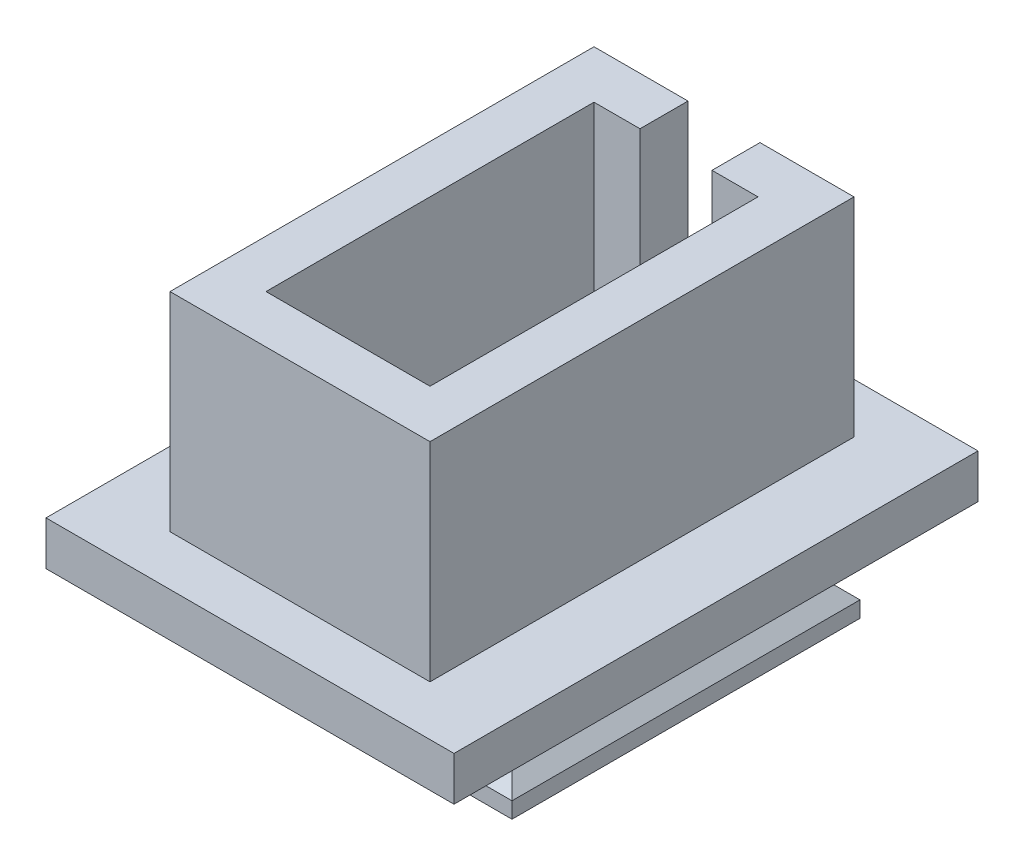
ISO-10303-21;
HEADER;
FILE_DESCRIPTION(('STEP AP214'),'2;1');
FILE_NAME('part.step','',(''),(''),'','','');
FILE_SCHEMA(('AUTOMOTIVE_DESIGN { 1 0 10303 214 1 1 1 1 }'));
ENDSEC;
DATA;
#1=APPLICATION_CONTEXT('core data for automotive mechanical design processes');
#2=APPLICATION_PROTOCOL_DEFINITION('international standard','automotive_design',2000,#1);
#3=PRODUCT_CONTEXT('',#1,'mechanical');
#4=PRODUCT('Part','Part','',(#3));
#5=PRODUCT_RELATED_PRODUCT_CATEGORY('part','',(#4));
#6=PRODUCT_DEFINITION_FORMATION('','',#4);
#7=PRODUCT_DEFINITION_CONTEXT('part definition',#1,'design');
#8=PRODUCT_DEFINITION('design','',#6,#7);
#9=PRODUCT_DEFINITION_SHAPE('','',#8);
#10=(LENGTH_UNIT() NAMED_UNIT(*) SI_UNIT(.MILLI.,.METRE.));
#11=(NAMED_UNIT(*) PLANE_ANGLE_UNIT() SI_UNIT($,.RADIAN.));
#12=(NAMED_UNIT(*) SI_UNIT($,.STERADIAN.) SOLID_ANGLE_UNIT());
#13=UNCERTAINTY_MEASURE_WITH_UNIT(LENGTH_MEASURE(1.E-05),#10,'distance_accuracy_value','');
#14=(GEOMETRIC_REPRESENTATION_CONTEXT(3) GLOBAL_UNCERTAINTY_ASSIGNED_CONTEXT((#13)) GLOBAL_UNIT_ASSIGNED_CONTEXT((#10,
#11,#12)) REPRESENTATION_CONTEXT('',''));
#15=CARTESIAN_POINT('',(0.,0.,0.));
#16=DIRECTION('',(0.,0.,1.));
#17=DIRECTION('',(1.,0.,0.));
#18=AXIS2_PLACEMENT_3D('',#15,#16,#17);
#19=CARTESIAN_POINT('',(0.,2.,0.));
#20=DIRECTION('',(0.,1.,0.));
#21=DIRECTION('',(0.,0.,1.));
#22=AXIS2_PLACEMENT_3D('',#19,#20,#21);
#23=PLANE('',#22);
#24=DIRECTION('',(0.,0.,1.));
#25=VECTOR('',#24,1.);
#26=CARTESIAN_POINT('',(-27.7004716981132,2.,-18.3643867924528));
#27=LINE('',#26,#25);
#28=CARTESIAN_POINT('',(-27.7004716981132,2.,-18.3643867924528));
#29=VERTEX_POINT('',#28);
#30=CARTESIAN_POINT('',(-27.7004716981132,2.,25.1356132075472));
#31=VERTEX_POINT('',#30);
#32=EDGE_CURVE('E322',#29,#31,#27,.T.);
#33=ORIENTED_EDGE('',*,*,#32,.F.);
#34=DIRECTION('',(-1.,0.,0.));
#35=VECTOR('',#34,1.);
#36=CARTESIAN_POINT('',(-27.7004716981132,2.,-18.3643867924528));
#37=LINE('',#36,#35);
#38=CARTESIAN_POINT('',(15.7995283018868,2.,-18.3643867924528));
#39=VERTEX_POINT('',#38);
#40=EDGE_CURVE('E330',#39,#29,#37,.T.);
#41=ORIENTED_EDGE('',*,*,#40,.F.);
#42=DIRECTION('',(0.,0.,-1.));
#43=VECTOR('',#42,1.);
#44=CARTESIAN_POINT('',(15.7995283018868,2.,-18.3643867924528));
#45=LINE('',#44,#43);
#46=CARTESIAN_POINT('',(15.7995283018868,2.,25.1356132075472));
#47=VERTEX_POINT('',#46);
#48=EDGE_CURVE('E327',#47,#39,#45,.T.);
#49=ORIENTED_EDGE('',*,*,#48,.F.);
#50=DIRECTION('',(1.,0.,0.));
#51=VECTOR('',#50,1.);
#52=CARTESIAN_POINT('',(-27.7004716981132,2.,25.1356132075472));
#53=LINE('',#52,#51);
#54=EDGE_CURVE('E325',#31,#47,#53,.T.);
#55=ORIENTED_EDGE('',*,*,#54,.F.);
#56=EDGE_LOOP('',(#33,#41,#49,#55));
#57=FACE_BOUND('',#56,.T.);
#58=ADVANCED_FACE('F46',(#57),#23,.F.);
#59=CARTESIAN_POINT('',(8.89976415094341,8.89976415094341,-18.3643867924528));
#60=DIRECTION('',(0.707106781186548,0.707106781186547,0.));
#61=DIRECTION('',(-0.707106781186547,0.707106781186548,0.));
#62=AXIS2_PLACEMENT_3D('',#59,#60,#61);
#63=PLANE('',#62);
#64=DIRECTION('',(0.577350269189626,-0.577350269189626,-0.577350269189626));
#65=VECTOR('',#64,1.);
#66=CARTESIAN_POINT('',(11.1996855345912,6.59984276729561,-13.7645440251572));
#67=LINE('',#66,#65);
#68=CARTESIAN_POINT('',(8.79952830188681,9.,-11.3643867924528));
#69=VERTEX_POINT('',#68);
#70=EDGE_CURVE('E310',#69,#39,#67,.T.);
#71=ORIENTED_EDGE('',*,*,#70,.F.);
#72=DIRECTION('',(0.,0.,1.));
#73=VECTOR('',#72,1.);
#74=CARTESIAN_POINT('',(8.79952830188681,9.,-18.3643867924528));
#75=LINE('',#74,#73);
#76=CARTESIAN_POINT('',(8.79952830188681,9.,18.1356132075472));
#77=VERTEX_POINT('',#76);
#78=EDGE_CURVE('E319',#69,#77,#75,.T.);
#79=ORIENTED_EDGE('',*,*,#78,.T.);
#80=DIRECTION('',(-0.577350269189626,0.577350269189626,-0.577350269189626));
#81=VECTOR('',#80,1.);
#82=CARTESIAN_POINT('',(-3.30031446540879,21.0998427672956,6.03577044025157));
#83=LINE('',#82,#81);
#84=EDGE_CURVE('E314',#47,#77,#83,.T.);
#85=ORIENTED_EDGE('',*,*,#84,.F.);
#86=ORIENTED_EDGE('',*,*,#48,.T.);
#87=EDGE_LOOP('',(#71,#79,#85,#86));
#88=FACE_BOUND('',#87,.T.);
#89=ADVANCED_FACE('F345',(#88),#63,.T.);
#90=CARTESIAN_POINT('',(-14.8502358490566,14.8502358490566,-18.3643867924528));
#91=DIRECTION('',(0.707106781186548,-0.707106781186547,0.));
#92=DIRECTION('',(0.707106781186547,0.707106781186548,0.));
#93=AXIS2_PLACEMENT_3D('',#90,#91,#92);
#94=PLANE('',#93);
#95=DIRECTION('',(0.,0.,1.));
#96=VECTOR('',#95,1.);
#97=CARTESIAN_POINT('',(-20.7004716981132,9.,-18.3643867924528));
#98=LINE('',#97,#96);
#99=CARTESIAN_POINT('',(-20.7004716981132,9.,-11.3643867924528));
#100=VERTEX_POINT('',#99);
#101=CARTESIAN_POINT('',(-20.7004716981132,9.,18.1356132075472));
#102=VERTEX_POINT('',#101);
#103=EDGE_CURVE('E317',#100,#102,#98,.T.);
#104=ORIENTED_EDGE('',*,*,#103,.F.);
#105=DIRECTION('',(-0.577350269189626,-0.577350269189626,-0.577350269189626));
#106=VECTOR('',#105,1.);
#107=CARTESIAN_POINT('',(-19.1336477987421,10.5668238993711,-9.79756289308177));
#108=LINE('',#107,#106);
#109=EDGE_CURVE('E12',#100,#29,#108,.T.);
#110=ORIENTED_EDGE('',*,*,#109,.T.);
#111=ORIENTED_EDGE('',*,*,#32,.T.);
#112=DIRECTION('',(0.577350269189626,0.577350269189626,-0.577350269189626));
#113=VECTOR('',#112,1.);
#114=CARTESIAN_POINT('',(-4.63364779874212,25.0668238993711,2.06878930817611));
#115=LINE('',#114,#113);
#116=EDGE_CURVE('E53',#31,#102,#115,.T.);
#117=ORIENTED_EDGE('',*,*,#116,.T.);
#118=EDGE_LOOP('',(#104,#110,#111,#117));
#119=FACE_BOUND('',#118,.T.);
#120=ADVANCED_FACE('F334',(#119),#94,.F.);
#121=CARTESIAN_POINT('',(-27.7004716981132,9.,18.1356132075472));
#122=DIRECTION('',(0.,-0.707106781186547,-0.707106781186547));
#123=DIRECTION('',(0.,0.707106781186548,-0.707106781186548));
#124=AXIS2_PLACEMENT_3D('',#121,#122,#123);
#125=PLANE('',#124);
#126=ORIENTED_EDGE('',*,*,#84,.T.);
#127=DIRECTION('',(1.,0.,0.));
#128=VECTOR('',#127,1.);
#129=CARTESIAN_POINT('',(-27.7004716981132,9.,18.1356132075472));
#130=LINE('',#129,#128);
#131=EDGE_CURVE('E312',#102,#77,#130,.T.);
#132=ORIENTED_EDGE('',*,*,#131,.F.);
#133=ORIENTED_EDGE('',*,*,#116,.F.);
#134=ORIENTED_EDGE('',*,*,#54,.T.);
#135=EDGE_LOOP('',(#126,#132,#133,#134));
#136=FACE_BOUND('',#135,.T.);
#137=ADVANCED_FACE('F339',(#136),#125,.F.);
#138=CARTESIAN_POINT('',(-27.7004716981132,9.,-11.3643867924528));
#139=DIRECTION('',(0.,-0.707106781186547,0.707106781186548));
#140=DIRECTION('',(0.,-0.707106781186548,-0.707106781186547));
#141=AXIS2_PLACEMENT_3D('',#138,#139,#140);
#142=PLANE('',#141);
#143=ORIENTED_EDGE('',*,*,#70,.T.);
#144=ORIENTED_EDGE('',*,*,#40,.T.);
#145=ORIENTED_EDGE('',*,*,#109,.F.);
#146=DIRECTION('',(1.,0.,0.));
#147=VECTOR('',#146,1.);
#148=CARTESIAN_POINT('',(-27.7004716981132,9.,-11.3643867924528));
#149=LINE('',#148,#147);
#150=EDGE_CURVE('E307',#100,#69,#149,.T.);
#151=ORIENTED_EDGE('',*,*,#150,.T.);
#152=EDGE_LOOP('',(#143,#144,#145,#151));
#153=FACE_BOUND('',#152,.T.);
#154=ADVANCED_FACE('F349',(#153),#142,.F.);
#155=CARTESIAN_POINT('',(0.,9.,0.));
#156=DIRECTION('',(0.,1.,0.));
#157=DIRECTION('',(0.,0.,1.));
#158=AXIS2_PLACEMENT_3D('',#155,#156,#157);
#159=PLANE('',#158);
#160=DIRECTION('',(0.,0.,1.));
#161=VECTOR('',#160,1.);
#162=CARTESIAN_POINT('',(-31.4504716981132,9.,36.1356132075472));
#163=LINE('',#162,#161);
#164=CARTESIAN_POINT('',(-31.4504716981132,9.,-29.3643867924528));
#165=VERTEX_POINT('',#164);
#166=CARTESIAN_POINT('',(-31.4504716981132,9.,36.1356132075472));
#167=VERTEX_POINT('',#166);
#168=EDGE_CURVE('E190',#165,#167,#163,.T.);
#169=ORIENTED_EDGE('',*,*,#168,.F.);
#170=DIRECTION('',(-1.,0.,0.));
#171=VECTOR('',#170,1.);
#172=CARTESIAN_POINT('',(19.5495283018868,9.,-29.3643867924528));
#173=LINE('',#172,#171);
#174=CARTESIAN_POINT('',(19.5495283018868,9.,-29.3643867924528));
#175=VERTEX_POINT('',#174);
#176=EDGE_CURVE('E282',#175,#165,#173,.T.);
#177=ORIENTED_EDGE('',*,*,#176,.F.);
#178=DIRECTION('',(0.,0.,-1.));
#179=VECTOR('',#178,1.);
#180=CARTESIAN_POINT('',(19.5495283018868,9.,36.1356132075472));
#181=LINE('',#180,#179);
#182=CARTESIAN_POINT('',(19.5495283018868,9.,36.1356132075472));
#183=VERTEX_POINT('',#182);
#184=EDGE_CURVE('E293',#183,#175,#181,.T.);
#185=ORIENTED_EDGE('',*,*,#184,.F.);
#186=DIRECTION('',(1.,0.,0.));
#187=VECTOR('',#186,1.);
#188=CARTESIAN_POINT('',(19.5495283018868,9.,36.1356132075472));
#189=LINE('',#188,#187);
#190=EDGE_CURVE('E291',#167,#183,#189,.T.);
#191=ORIENTED_EDGE('',*,*,#190,.F.);
#192=EDGE_LOOP('',(#169,#177,#185,#191));
#193=FACE_BOUND('',#192,.T.);
#194=ORIENTED_EDGE('',*,*,#103,.T.);
#195=ORIENTED_EDGE('',*,*,#131,.T.);
#196=ORIENTED_EDGE('',*,*,#78,.F.);
#197=ORIENTED_EDGE('',*,*,#150,.F.);
#198=EDGE_LOOP('',(#194,#195,#196,#197));
#199=FACE_BOUND('',#198,.T.);
#200=ADVANCED_FACE('F342',(#193,#199),#159,.F.);
#201=CARTESIAN_POINT('',(-31.4504716981132,14.5,36.1356132075472));
#202=DIRECTION('',(1.,0.,0.));
#203=DIRECTION('',(0.,0.,-1.));
#204=AXIS2_PLACEMENT_3D('',#201,#202,#203);
#205=PLANE('',#204);
#206=ORIENTED_EDGE('',*,*,#168,.T.);
#207=DIRECTION('',(0.,-1.,0.));
#208=VECTOR('',#207,1.);
#209=CARTESIAN_POINT('',(-31.4504716981132,14.5,36.1356132075472));
#210=LINE('',#209,#208);
#211=CARTESIAN_POINT('',(-31.4504716981132,14.5,36.1356132075472));
#212=VERTEX_POINT('',#211);
#213=EDGE_CURVE('E304',#212,#167,#210,.T.);
#214=ORIENTED_EDGE('',*,*,#213,.F.);
#215=DIRECTION('',(0.,0.,1.));
#216=VECTOR('',#215,1.);
#217=CARTESIAN_POINT('',(-31.4504716981132,14.5,36.1356132075472));
#218=LINE('',#217,#216);
#219=CARTESIAN_POINT('',(-31.4504716981132,14.5,-29.3643867924528));
#220=VERTEX_POINT('',#219);
#221=EDGE_CURVE('E278',#220,#212,#218,.T.);
#222=ORIENTED_EDGE('',*,*,#221,.F.);
#223=DIRECTION('',(0.,-1.,0.));
#224=VECTOR('',#223,1.);
#225=CARTESIAN_POINT('',(-31.4504716981132,14.5,-29.3643867924528));
#226=LINE('',#225,#224);
#227=EDGE_CURVE('E288',#220,#165,#226,.T.);
#228=ORIENTED_EDGE('',*,*,#227,.T.);
#229=EDGE_LOOP('',(#206,#214,#222,#228));
#230=FACE_BOUND('',#229,.T.);
#231=ADVANCED_FACE('F365',(#230),#205,.F.);
#232=CARTESIAN_POINT('',(19.5495283018868,14.5,36.1356132075472));
#233=DIRECTION('',(0.,0.,-1.));
#234=DIRECTION('',(-1.,0.,0.));
#235=AXIS2_PLACEMENT_3D('',#232,#233,#234);
#236=PLANE('',#235);
#237=ORIENTED_EDGE('',*,*,#190,.T.);
#238=DIRECTION('',(0.,-1.,0.));
#239=VECTOR('',#238,1.);
#240=CARTESIAN_POINT('',(19.5495283018868,14.5,36.1356132075472));
#241=LINE('',#240,#239);
#242=CARTESIAN_POINT('',(19.5495283018868,14.5,36.1356132075472));
#243=VERTEX_POINT('',#242);
#244=EDGE_CURVE('E301',#243,#183,#241,.T.);
#245=ORIENTED_EDGE('',*,*,#244,.F.);
#246=DIRECTION('',(1.,0.,0.));
#247=VECTOR('',#246,1.);
#248=CARTESIAN_POINT('',(19.5495283018868,14.5,36.1356132075472));
#249=LINE('',#248,#247);
#250=EDGE_CURVE('E281',#212,#243,#249,.T.);
#251=ORIENTED_EDGE('',*,*,#250,.F.);
#252=ORIENTED_EDGE('',*,*,#213,.T.);
#253=EDGE_LOOP('',(#237,#245,#251,#252));
#254=FACE_BOUND('',#253,.T.);
#255=ADVANCED_FACE('F368',(#254),#236,.F.);
#256=CARTESIAN_POINT('',(19.5495283018868,14.5,36.1356132075472));
#257=DIRECTION('',(-1.,0.,0.));
#258=DIRECTION('',(0.,0.,1.));
#259=AXIS2_PLACEMENT_3D('',#256,#257,#258);
#260=PLANE('',#259);
#261=ORIENTED_EDGE('',*,*,#184,.T.);
#262=DIRECTION('',(0.,-1.,0.));
#263=VECTOR('',#262,1.);
#264=CARTESIAN_POINT('',(19.5495283018868,14.5,-29.3643867924528));
#265=LINE('',#264,#263);
#266=CARTESIAN_POINT('',(19.5495283018868,14.5,-29.3643867924528));
#267=VERTEX_POINT('',#266);
#268=EDGE_CURVE('E298',#267,#175,#265,.T.);
#269=ORIENTED_EDGE('',*,*,#268,.F.);
#270=DIRECTION('',(0.,0.,-1.));
#271=VECTOR('',#270,1.);
#272=CARTESIAN_POINT('',(19.5495283018868,14.5,36.1356132075472));
#273=LINE('',#272,#271);
#274=EDGE_CURVE('E284',#243,#267,#273,.T.);
#275=ORIENTED_EDGE('',*,*,#274,.F.);
#276=ORIENTED_EDGE('',*,*,#244,.T.);
#277=EDGE_LOOP('',(#261,#269,#275,#276));
#278=FACE_BOUND('',#277,.T.);
#279=ADVANCED_FACE('F372',(#278),#260,.F.);
#280=CARTESIAN_POINT('',(19.5495283018868,14.5,-29.3643867924528));
#281=DIRECTION('',(0.,0.,1.));
#282=DIRECTION('',(1.,0.,0.));
#283=AXIS2_PLACEMENT_3D('',#280,#281,#282);
#284=PLANE('',#283);
#285=ORIENTED_EDGE('',*,*,#176,.T.);
#286=ORIENTED_EDGE('',*,*,#227,.F.);
#287=DIRECTION('',(-1.,0.,0.));
#288=VECTOR('',#287,1.);
#289=CARTESIAN_POINT('',(19.5495283018868,14.5,-29.3643867924528));
#290=LINE('',#289,#288);
#291=EDGE_CURVE('E286',#267,#220,#290,.T.);
#292=ORIENTED_EDGE('',*,*,#291,.F.);
#293=ORIENTED_EDGE('',*,*,#268,.T.);
#294=EDGE_LOOP('',(#285,#286,#292,#293));
#295=FACE_BOUND('',#294,.T.);
#296=ADVANCED_FACE('F376',(#295),#284,.F.);
#297=CARTESIAN_POINT('',(0.,14.5,0.));
#298=DIRECTION('',(0.,1.,0.));
#299=DIRECTION('',(0.,0.,1.));
#300=AXIS2_PLACEMENT_3D('',#297,#298,#299);
#301=PLANE('',#300);
#302=DIRECTION('',(0.,0.,-1.));
#303=VECTOR('',#302,1.);
#304=CARTESIAN_POINT('',(-1.45047169811266,14.5,0.));
#305=LINE('',#304,#303);
#306=CARTESIAN_POINT('',(-1.45047169811266,14.5,-17.1143867924528));
#307=VERTEX_POINT('',#306);
#308=CARTESIAN_POINT('',(-1.45047169811266,14.5,-23.1143867924528));
#309=VERTEX_POINT('',#308);
#310=EDGE_CURVE('E188',#307,#309,#305,.T.);
#311=ORIENTED_EDGE('',*,*,#310,.T.);
#312=DIRECTION('',(1.,0.,0.));
#313=VECTOR('',#312,1.);
#314=CARTESIAN_POINT('',(0.,14.5,-23.1143867924528));
#315=LINE('',#314,#313);
#316=CARTESIAN_POINT('',(10.2995283018873,14.5,-23.1143867924528));
#317=VERTEX_POINT('',#316);
#318=EDGE_CURVE('E205',#309,#317,#315,.T.);
#319=ORIENTED_EDGE('',*,*,#318,.T.);
#320=DIRECTION('',(0.,0.,-1.));
#321=VECTOR('',#320,1.);
#322=CARTESIAN_POINT('',(10.2995283018873,14.5,0.));
#323=LINE('',#322,#321);
#324=CARTESIAN_POINT('',(10.2995283018873,14.5,29.8856132075472));
#325=VERTEX_POINT('',#324);
#326=EDGE_CURVE('E207',#325,#317,#323,.T.);
#327=ORIENTED_EDGE('',*,*,#326,.F.);
#328=DIRECTION('',(1.,0.,0.));
#329=VECTOR('',#328,1.);
#330=CARTESIAN_POINT('',(0.,14.5,29.8856132075472));
#331=LINE('',#330,#329);
#332=CARTESIAN_POINT('',(-22.2004716981127,14.5,29.8856132075472));
#333=VERTEX_POINT('',#332);
#334=EDGE_CURVE('E243',#333,#325,#331,.T.);
#335=ORIENTED_EDGE('',*,*,#334,.F.);
#336=DIRECTION('',(0.,0.,-1.));
#337=VECTOR('',#336,1.);
#338=CARTESIAN_POINT('',(-22.2004716981127,14.5,0.));
#339=LINE('',#338,#337);
#340=CARTESIAN_POINT('',(-22.2004716981127,14.5,-23.1143867924528));
#341=VERTEX_POINT('',#340);
#342=EDGE_CURVE('E241',#333,#341,#339,.T.);
#343=ORIENTED_EDGE('',*,*,#342,.T.);
#344=CARTESIAN_POINT('',(-10.4504716981127,14.5,-23.1143867924528));
#345=VERTEX_POINT('',#344);
#346=EDGE_CURVE('E209',#341,#345,#315,.T.);
#347=ORIENTED_EDGE('',*,*,#346,.T.);
#348=DIRECTION('',(0.,0.,-1.));
#349=VECTOR('',#348,1.);
#350=CARTESIAN_POINT('',(-10.4504716981127,14.5,0.));
#351=LINE('',#350,#349);
#352=CARTESIAN_POINT('',(-10.4504716981127,14.5,-17.1143867924528));
#353=VERTEX_POINT('',#352);
#354=EDGE_CURVE('E238',#353,#345,#351,.T.);
#355=ORIENTED_EDGE('',*,*,#354,.F.);
#356=DIRECTION('',(1.,0.,0.));
#357=VECTOR('',#356,1.);
#358=CARTESIAN_POINT('',(0.,14.5,-17.1143867924528));
#359=LINE('',#358,#357);
#360=CARTESIAN_POINT('',(-16.2004716981127,14.5,-17.1143867924528));
#361=VERTEX_POINT('',#360);
#362=EDGE_CURVE('E231',#361,#353,#359,.T.);
#363=ORIENTED_EDGE('',*,*,#362,.F.);
#364=DIRECTION('',(0.,0.,-1.));
#365=VECTOR('',#364,1.);
#366=CARTESIAN_POINT('',(-16.2004716981127,14.5,0.));
#367=LINE('',#366,#365);
#368=CARTESIAN_POINT('',(-16.2004716981127,14.5,23.8856132075472));
#369=VERTEX_POINT('',#368);
#370=EDGE_CURVE('E235',#369,#361,#367,.T.);
#371=ORIENTED_EDGE('',*,*,#370,.F.);
#372=DIRECTION('',(1.,0.,0.));
#373=VECTOR('',#372,1.);
#374=CARTESIAN_POINT('',(0.,14.5,23.8856132075472));
#375=LINE('',#374,#373);
#376=CARTESIAN_POINT('',(4.29952830188734,14.5,23.8856132075472));
#377=VERTEX_POINT('',#376);
#378=EDGE_CURVE('E233',#369,#377,#375,.T.);
#379=ORIENTED_EDGE('',*,*,#378,.T.);
#380=DIRECTION('',(0.,0.,-1.));
#381=VECTOR('',#380,1.);
#382=CARTESIAN_POINT('',(4.29952830188734,14.5,0.));
#383=LINE('',#382,#381);
#384=CARTESIAN_POINT('',(4.29952830188734,14.5,-17.1143867924528));
#385=VERTEX_POINT('',#384);
#386=EDGE_CURVE('E65',#377,#385,#383,.T.);
#387=ORIENTED_EDGE('',*,*,#386,.T.);
#388=EDGE_CURVE('E60',#307,#385,#359,.T.);
#389=ORIENTED_EDGE('',*,*,#388,.F.);
#390=EDGE_LOOP('',(#311,#319,#327,#335,#343,#347,#355,#363,#371,#379,#387,#389));
#391=FACE_BOUND('',#390,.T.);
#392=ORIENTED_EDGE('',*,*,#221,.T.);
#393=ORIENTED_EDGE('',*,*,#250,.T.);
#394=ORIENTED_EDGE('',*,*,#274,.T.);
#395=ORIENTED_EDGE('',*,*,#291,.T.);
#396=EDGE_LOOP('',(#392,#393,#394,#395));
#397=FACE_BOUND('',#396,.T.);
#398=ADVANCED_FACE('F380',(#391,#397),#301,.T.);
#399=CARTESIAN_POINT('',(-1.45047169811266,40.5,0.));
#400=DIRECTION('',(-1.,0.,0.));
#401=DIRECTION('',(0.,0.,1.));
#402=AXIS2_PLACEMENT_3D('',#399,#400,#401);
#403=PLANE('',#402);
#404=ORIENTED_EDGE('',*,*,#310,.F.);
#405=DIRECTION('',(0.,-1.,0.));
#406=VECTOR('',#405,1.);
#407=CARTESIAN_POINT('',(-1.45047169811266,40.5,-17.1143867924528));
#408=LINE('',#407,#406);
#409=CARTESIAN_POINT('',(-1.45047169811266,40.5,-17.1143867924528));
#410=VERTEX_POINT('',#409);
#411=EDGE_CURVE('E181',#410,#307,#408,.T.);
#412=ORIENTED_EDGE('',*,*,#411,.F.);
#413=DIRECTION('',(0.,0.,-1.));
#414=VECTOR('',#413,1.);
#415=CARTESIAN_POINT('',(-1.45047169811266,40.5,0.));
#416=LINE('',#415,#414);
#417=CARTESIAN_POINT('',(-1.45047169811266,40.5,-23.1143867924528));
#418=VERTEX_POINT('',#417);
#419=EDGE_CURVE('E186',#410,#418,#416,.T.);
#420=ORIENTED_EDGE('',*,*,#419,.T.);
#421=DIRECTION('',(0.,-1.,0.));
#422=VECTOR('',#421,1.);
#423=CARTESIAN_POINT('',(-1.45047169811266,40.5,-23.1143867924528));
#424=LINE('',#423,#422);
#425=EDGE_CURVE('E248',#418,#309,#424,.T.);
#426=ORIENTED_EDGE('',*,*,#425,.T.);
#427=EDGE_LOOP('',(#404,#412,#420,#426));
#428=FACE_BOUND('',#427,.T.);
#429=ADVANCED_FACE('F183',(#428),#403,.T.);
#430=CARTESIAN_POINT('',(0.,40.5,-17.1143867924528));
#431=DIRECTION('',(0.,0.,-1.));
#432=DIRECTION('',(-1.,0.,0.));
#433=AXIS2_PLACEMENT_3D('',#430,#431,#432);
#434=PLANE('',#433);
#435=ORIENTED_EDGE('',*,*,#388,.T.);
#436=DIRECTION('',(0.,-1.,0.));
#437=VECTOR('',#436,1.);
#438=CARTESIAN_POINT('',(4.29952830188734,40.5,-17.1143867924528));
#439=LINE('',#438,#437);
#440=CARTESIAN_POINT('',(4.29952830188734,40.5,-17.1143867924528));
#441=VERTEX_POINT('',#440);
#442=EDGE_CURVE('E191',#441,#385,#439,.T.);
#443=ORIENTED_EDGE('',*,*,#442,.F.);
#444=DIRECTION('',(1.,0.,0.));
#445=VECTOR('',#444,1.);
#446=CARTESIAN_POINT('',(0.,40.5,-17.1143867924528));
#447=LINE('',#446,#445);
#448=EDGE_CURVE('E194',#410,#441,#447,.T.);
#449=ORIENTED_EDGE('',*,*,#448,.F.);
#450=ORIENTED_EDGE('',*,*,#411,.T.);
#451=EDGE_LOOP('',(#435,#443,#449,#450));
#452=FACE_BOUND('',#451,.T.);
#453=ADVANCED_FACE('F195',(#452),#434,.F.);
#454=CARTESIAN_POINT('',(4.29952830188734,40.5,0.));
#455=DIRECTION('',(-1.,0.,0.));
#456=DIRECTION('',(0.,0.,1.));
#457=AXIS2_PLACEMENT_3D('',#454,#455,#456);
#458=PLANE('',#457);
#459=ORIENTED_EDGE('',*,*,#386,.F.);
#460=DIRECTION('',(0.,-1.,0.));
#461=VECTOR('',#460,1.);
#462=CARTESIAN_POINT('',(4.29952830188734,40.5,23.8856132075472));
#463=LINE('',#462,#461);
#464=CARTESIAN_POINT('',(4.29952830188734,40.5,23.8856132075472));
#465=VERTEX_POINT('',#464);
#466=EDGE_CURVE('E274',#465,#377,#463,.T.);
#467=ORIENTED_EDGE('',*,*,#466,.F.);
#468=DIRECTION('',(0.,0.,-1.));
#469=VECTOR('',#468,1.);
#470=CARTESIAN_POINT('',(4.29952830188734,40.5,0.));
#471=LINE('',#470,#469);
#472=EDGE_CURVE('E199',#465,#441,#471,.T.);
#473=ORIENTED_EDGE('',*,*,#472,.T.);
#474=ORIENTED_EDGE('',*,*,#442,.T.);
#475=EDGE_LOOP('',(#459,#467,#473,#474));
#476=FACE_BOUND('',#475,.T.);
#477=ADVANCED_FACE('F389',(#476),#458,.T.);
#478=CARTESIAN_POINT('',(0.,40.5,23.8856132075472));
#479=DIRECTION('',(0.,0.,-1.));
#480=DIRECTION('',(-1.,0.,0.));
#481=AXIS2_PLACEMENT_3D('',#478,#479,#480);
#482=PLANE('',#481);
#483=ORIENTED_EDGE('',*,*,#378,.F.);
#484=DIRECTION('',(0.,-1.,0.));
#485=VECTOR('',#484,1.);
#486=CARTESIAN_POINT('',(-16.2004716981127,40.5,23.8856132075472));
#487=LINE('',#486,#485);
#488=CARTESIAN_POINT('',(-16.2004716981127,40.5,23.8856132075472));
#489=VERTEX_POINT('',#488);
#490=EDGE_CURVE('E271',#489,#369,#487,.T.);
#491=ORIENTED_EDGE('',*,*,#490,.F.);
#492=DIRECTION('',(1.,0.,0.));
#493=VECTOR('',#492,1.);
#494=CARTESIAN_POINT('',(0.,40.5,23.8856132075472));
#495=LINE('',#494,#493);
#496=EDGE_CURVE('E212',#489,#465,#495,.T.);
#497=ORIENTED_EDGE('',*,*,#496,.T.);
#498=ORIENTED_EDGE('',*,*,#466,.T.);
#499=EDGE_LOOP('',(#483,#491,#497,#498));
#500=FACE_BOUND('',#499,.T.);
#501=ADVANCED_FACE('F392',(#500),#482,.T.);
#502=CARTESIAN_POINT('',(-16.2004716981127,40.5,0.));
#503=DIRECTION('',(-1.,0.,0.));
#504=DIRECTION('',(0.,0.,1.));
#505=AXIS2_PLACEMENT_3D('',#502,#503,#504);
#506=PLANE('',#505);
#507=ORIENTED_EDGE('',*,*,#370,.T.);
#508=DIRECTION('',(0.,-1.,0.));
#509=VECTOR('',#508,1.);
#510=CARTESIAN_POINT('',(-16.2004716981127,40.5,-17.1143867924528));
#511=LINE('',#510,#509);
#512=CARTESIAN_POINT('',(-16.2004716981127,40.5,-17.1143867924528));
#513=VERTEX_POINT('',#512);
#514=EDGE_CURVE('E268',#513,#361,#511,.T.);
#515=ORIENTED_EDGE('',*,*,#514,.F.);
#516=DIRECTION('',(0.,0.,-1.));
#517=VECTOR('',#516,1.);
#518=CARTESIAN_POINT('',(-16.2004716981127,40.5,0.));
#519=LINE('',#518,#517);
#520=EDGE_CURVE('E215',#489,#513,#519,.T.);
#521=ORIENTED_EDGE('',*,*,#520,.F.);
#522=ORIENTED_EDGE('',*,*,#490,.T.);
#523=EDGE_LOOP('',(#507,#515,#521,#522));
#524=FACE_BOUND('',#523,.T.);
#525=ADVANCED_FACE('F396',(#524),#506,.F.);
#526=ORIENTED_EDGE('',*,*,#362,.T.);
#527=DIRECTION('',(0.,-1.,0.));
#528=VECTOR('',#527,1.);
#529=CARTESIAN_POINT('',(-10.4504716981127,40.5,-17.1143867924528));
#530=LINE('',#529,#528);
#531=CARTESIAN_POINT('',(-10.4504716981127,40.5,-17.1143867924528));
#532=VERTEX_POINT('',#531);
#533=EDGE_CURVE('E265',#532,#353,#530,.T.);
#534=ORIENTED_EDGE('',*,*,#533,.F.);
#535=EDGE_CURVE('E201',#513,#532,#447,.T.);
#536=ORIENTED_EDGE('',*,*,#535,.F.);
#537=ORIENTED_EDGE('',*,*,#514,.T.);
#538=EDGE_LOOP('',(#526,#534,#536,#537));
#539=FACE_BOUND('',#538,.T.);
#540=ADVANCED_FACE('F400',(#539),#434,.F.);
#541=CARTESIAN_POINT('',(-10.4504716981127,40.5,0.));
#542=DIRECTION('',(-1.,0.,0.));
#543=DIRECTION('',(0.,0.,1.));
#544=AXIS2_PLACEMENT_3D('',#541,#542,#543);
#545=PLANE('',#544);
#546=ORIENTED_EDGE('',*,*,#354,.T.);
#547=DIRECTION('',(0.,-1.,0.));
#548=VECTOR('',#547,1.);
#549=CARTESIAN_POINT('',(-10.4504716981127,40.5,-23.1143867924528));
#550=LINE('',#549,#548);
#551=CARTESIAN_POINT('',(-10.4504716981127,40.5,-23.1143867924528));
#552=VERTEX_POINT('',#551);
#553=EDGE_CURVE('E262',#552,#345,#550,.T.);
#554=ORIENTED_EDGE('',*,*,#553,.F.);
#555=DIRECTION('',(0.,0.,-1.));
#556=VECTOR('',#555,1.);
#557=CARTESIAN_POINT('',(-10.4504716981127,40.5,0.));
#558=LINE('',#557,#556);
#559=EDGE_CURVE('E217',#532,#552,#558,.T.);
#560=ORIENTED_EDGE('',*,*,#559,.F.);
#561=ORIENTED_EDGE('',*,*,#533,.T.);
#562=EDGE_LOOP('',(#546,#554,#560,#561));
#563=FACE_BOUND('',#562,.T.);
#564=ADVANCED_FACE('F404',(#563),#545,.F.);
#565=CARTESIAN_POINT('',(0.,40.5,-23.1143867924528));
#566=DIRECTION('',(0.,0.,-1.));
#567=DIRECTION('',(-1.,0.,0.));
#568=AXIS2_PLACEMENT_3D('',#565,#566,#567);
#569=PLANE('',#568);
#570=ORIENTED_EDGE('',*,*,#346,.F.);
#571=DIRECTION('',(0.,-1.,0.));
#572=VECTOR('',#571,1.);
#573=CARTESIAN_POINT('',(-22.2004716981127,40.5,-23.1143867924528));
#574=LINE('',#573,#572);
#575=CARTESIAN_POINT('',(-22.2004716981127,40.5,-23.1143867924528));
#576=VERTEX_POINT('',#575);
#577=EDGE_CURVE('E259',#576,#341,#574,.T.);
#578=ORIENTED_EDGE('',*,*,#577,.F.);
#579=DIRECTION('',(1.,0.,0.));
#580=VECTOR('',#579,1.);
#581=CARTESIAN_POINT('',(0.,40.5,-23.1143867924528));
#582=LINE('',#581,#580);
#583=EDGE_CURVE('E219',#576,#552,#582,.T.);
#584=ORIENTED_EDGE('',*,*,#583,.T.);
#585=ORIENTED_EDGE('',*,*,#553,.T.);
#586=EDGE_LOOP('',(#570,#578,#584,#585));
#587=FACE_BOUND('',#586,.T.);
#588=ADVANCED_FACE('F408',(#587),#569,.T.);
#589=CARTESIAN_POINT('',(-22.2004716981127,40.5,0.));
#590=DIRECTION('',(-1.,0.,0.));
#591=DIRECTION('',(0.,0.,1.));
#592=AXIS2_PLACEMENT_3D('',#589,#590,#591);
#593=PLANE('',#592);
#594=ORIENTED_EDGE('',*,*,#342,.F.);
#595=DIRECTION('',(0.,-1.,0.));
#596=VECTOR('',#595,1.);
#597=CARTESIAN_POINT('',(-22.2004716981127,40.5,29.8856132075472));
#598=LINE('',#597,#596);
#599=CARTESIAN_POINT('',(-22.2004716981127,40.5,29.8856132075472));
#600=VERTEX_POINT('',#599);
#601=EDGE_CURVE('E256',#600,#333,#598,.T.);
#602=ORIENTED_EDGE('',*,*,#601,.F.);
#603=DIRECTION('',(0.,0.,-1.));
#604=VECTOR('',#603,1.);
#605=CARTESIAN_POINT('',(-22.2004716981127,40.5,0.));
#606=LINE('',#605,#604);
#607=EDGE_CURVE('E222',#600,#576,#606,.T.);
#608=ORIENTED_EDGE('',*,*,#607,.T.);
#609=ORIENTED_EDGE('',*,*,#577,.T.);
#610=EDGE_LOOP('',(#594,#602,#608,#609));
#611=FACE_BOUND('',#610,.T.);
#612=ADVANCED_FACE('F410',(#611),#593,.T.);
#613=CARTESIAN_POINT('',(0.,40.5,29.8856132075472));
#614=DIRECTION('',(0.,0.,-1.));
#615=DIRECTION('',(-1.,0.,0.));
#616=AXIS2_PLACEMENT_3D('',#613,#614,#615);
#617=PLANE('',#616);
#618=ORIENTED_EDGE('',*,*,#334,.T.);
#619=DIRECTION('',(0.,-1.,0.));
#620=VECTOR('',#619,1.);
#621=CARTESIAN_POINT('',(10.2995283018873,40.5,29.8856132075472));
#622=LINE('',#621,#620);
#623=CARTESIAN_POINT('',(10.2995283018873,40.5,29.8856132075472));
#624=VERTEX_POINT('',#623);
#625=EDGE_CURVE('E253',#624,#325,#622,.T.);
#626=ORIENTED_EDGE('',*,*,#625,.F.);
#627=DIRECTION('',(1.,0.,0.));
#628=VECTOR('',#627,1.);
#629=CARTESIAN_POINT('',(0.,40.5,29.8856132075472));
#630=LINE('',#629,#628);
#631=EDGE_CURVE('E225',#600,#624,#630,.T.);
#632=ORIENTED_EDGE('',*,*,#631,.F.);
#633=ORIENTED_EDGE('',*,*,#601,.T.);
#634=EDGE_LOOP('',(#618,#626,#632,#633));
#635=FACE_BOUND('',#634,.T.);
#636=ADVANCED_FACE('F413',(#635),#617,.F.);
#637=CARTESIAN_POINT('',(10.2995283018873,40.5,0.));
#638=DIRECTION('',(-1.,0.,0.));
#639=DIRECTION('',(0.,0.,1.));
#640=AXIS2_PLACEMENT_3D('',#637,#638,#639);
#641=PLANE('',#640);
#642=ORIENTED_EDGE('',*,*,#326,.T.);
#643=DIRECTION('',(0.,-1.,0.));
#644=VECTOR('',#643,1.);
#645=CARTESIAN_POINT('',(10.2995283018873,40.5,-23.1143867924528));
#646=LINE('',#645,#644);
#647=CARTESIAN_POINT('',(10.2995283018873,40.5,-23.1143867924528));
#648=VERTEX_POINT('',#647);
#649=EDGE_CURVE('E250',#648,#317,#646,.T.);
#650=ORIENTED_EDGE('',*,*,#649,.F.);
#651=DIRECTION('',(0.,0.,-1.));
#652=VECTOR('',#651,1.);
#653=CARTESIAN_POINT('',(10.2995283018873,40.5,0.));
#654=LINE('',#653,#652);
#655=EDGE_CURVE('E227',#624,#648,#654,.T.);
#656=ORIENTED_EDGE('',*,*,#655,.F.);
#657=ORIENTED_EDGE('',*,*,#625,.T.);
#658=EDGE_LOOP('',(#642,#650,#656,#657));
#659=FACE_BOUND('',#658,.T.);
#660=ADVANCED_FACE('F417',(#659),#641,.F.);
#661=ORIENTED_EDGE('',*,*,#318,.F.);
#662=ORIENTED_EDGE('',*,*,#425,.F.);
#663=EDGE_CURVE('E204',#418,#648,#582,.T.);
#664=ORIENTED_EDGE('',*,*,#663,.T.);
#665=ORIENTED_EDGE('',*,*,#649,.T.);
#666=EDGE_LOOP('',(#661,#662,#664,#665));
#667=FACE_BOUND('',#666,.T.);
#668=ADVANCED_FACE('F421',(#667),#569,.T.);
#669=CARTESIAN_POINT('',(0.,40.5,0.));
#670=DIRECTION('',(0.,1.,0.));
#671=DIRECTION('',(0.,0.,1.));
#672=AXIS2_PLACEMENT_3D('',#669,#670,#671);
#673=PLANE('',#672);
#674=ORIENTED_EDGE('',*,*,#419,.F.);
#675=ORIENTED_EDGE('',*,*,#448,.T.);
#676=ORIENTED_EDGE('',*,*,#472,.F.);
#677=ORIENTED_EDGE('',*,*,#496,.F.);
#678=ORIENTED_EDGE('',*,*,#520,.T.);
#679=ORIENTED_EDGE('',*,*,#535,.T.);
#680=ORIENTED_EDGE('',*,*,#559,.T.);
#681=ORIENTED_EDGE('',*,*,#583,.F.);
#682=ORIENTED_EDGE('',*,*,#607,.F.);
#683=ORIENTED_EDGE('',*,*,#631,.T.);
#684=ORIENTED_EDGE('',*,*,#655,.T.);
#685=ORIENTED_EDGE('',*,*,#663,.F.);
#686=EDGE_LOOP('',(#674,#675,#676,#677,#678,#679,#680,#681,#682,#683,#684,#685));
#687=FACE_BOUND('',#686,.T.);
#688=ADVANCED_FACE('F202',(#687),#673,.T.);
#689=CLOSED_SHELL('',(#58,#89,#120,#137,#154,#200,#231,#255,#279,#296,#398,#429,#453,#477,#501,
#525,#540,#564,#588,#612,#636,#660,#668,#688));
#690=MANIFOLD_SOLID_BREP('B2',#689);
#691=CARTESIAN_POINT('',(-27.7004716981132,2.,-18.3643867924528));
#692=DIRECTION('',(1.,0.,0.));
#693=DIRECTION('',(0.,0.,-1.));
#694=AXIS2_PLACEMENT_3D('',#691,#692,#693);
#695=PLANE('',#694);
#696=DIRECTION('',(0.,0.,1.));
#697=VECTOR('',#696,1.);
#698=CARTESIAN_POINT('',(-27.7004716981132,0.,-18.3643867924528));
#699=LINE('',#698,#697);
#700=CARTESIAN_POINT('',(-27.7004716981132,0.,-18.3643867924528));
#701=VERTEX_POINT('',#700);
#702=CARTESIAN_POINT('',(-27.7004716981132,0.,25.1356132075472));
#703=VERTEX_POINT('',#702);
#704=EDGE_CURVE('E664',#701,#703,#699,.T.);
#705=ORIENTED_EDGE('',*,*,#704,.T.);
#706=DIRECTION('',(0.,-1.,0.));
#707=VECTOR('',#706,1.);
#708=CARTESIAN_POINT('',(-27.7004716981132,2.,25.1356132075472));
#709=LINE('',#708,#707);
#710=CARTESIAN_POINT('',(-27.7004716981132,2.,25.1356132075472));
#711=VERTEX_POINT('',#710);
#712=EDGE_CURVE('E44',#711,#703,#709,.T.);
#713=ORIENTED_EDGE('',*,*,#712,.F.);
#714=DIRECTION('',(0.,0.,1.));
#715=VECTOR('',#714,1.);
#716=CARTESIAN_POINT('',(-27.7004716981132,2.,-18.3643867924528));
#717=LINE('',#716,#715);
#718=CARTESIAN_POINT('',(-27.7004716981132,2.,-18.3643867924528));
#719=VERTEX_POINT('',#718);
#720=EDGE_CURVE('E652',#719,#711,#717,.T.);
#721=ORIENTED_EDGE('',*,*,#720,.F.);
#722=DIRECTION('',(0.,-1.,0.));
#723=VECTOR('',#722,1.);
#724=CARTESIAN_POINT('',(-27.7004716981132,2.,-18.3643867924528));
#725=LINE('',#724,#723);
#726=EDGE_CURVE('E660',#719,#701,#725,.T.);
#727=ORIENTED_EDGE('',*,*,#726,.T.);
#728=EDGE_LOOP('',(#705,#713,#721,#727));
#729=FACE_BOUND('',#728,.T.);
#730=ADVANCED_FACE('F601',(#729),#695,.F.);
#731=CARTESIAN_POINT('',(-27.7004716981132,2.,25.1356132075472));
#732=DIRECTION('',(0.,0.,-1.));
#733=DIRECTION('',(-1.,0.,0.));
#734=AXIS2_PLACEMENT_3D('',#731,#732,#733);
#735=PLANE('',#734);
#736=DIRECTION('',(1.,0.,0.));
#737=VECTOR('',#736,1.);
#738=CARTESIAN_POINT('',(-27.7004716981132,0.,25.1356132075472));
#739=LINE('',#738,#737);
#740=CARTESIAN_POINT('',(15.7995283018868,0.,25.1356132075472));
#741=VERTEX_POINT('',#740);
#742=EDGE_CURVE('E656',#703,#741,#739,.T.);
#743=ORIENTED_EDGE('',*,*,#742,.T.);
#744=DIRECTION('',(0.,-1.,0.));
#745=VECTOR('',#744,1.);
#746=CARTESIAN_POINT('',(15.7995283018868,2.,25.1356132075472));
#747=LINE('',#746,#745);
#748=CARTESIAN_POINT('',(15.7995283018868,2.,25.1356132075472));
#749=VERTEX_POINT('',#748);
#750=EDGE_CURVE('E609',#749,#741,#747,.T.);
#751=ORIENTED_EDGE('',*,*,#750,.F.);
#752=DIRECTION('',(1.,0.,0.));
#753=VECTOR('',#752,1.);
#754=CARTESIAN_POINT('',(-27.7004716981132,2.,25.1356132075472));
#755=LINE('',#754,#753);
#756=EDGE_CURVE('E647',#711,#749,#755,.T.);
#757=ORIENTED_EDGE('',*,*,#756,.F.);
#758=ORIENTED_EDGE('',*,*,#712,.T.);
#759=EDGE_LOOP('',(#743,#751,#757,#758));
#760=FACE_BOUND('',#759,.T.);
#761=ADVANCED_FACE('F655',(#760),#735,.F.);
#762=CARTESIAN_POINT('',(15.7995283018868,2.,-18.3643867924528));
#763=DIRECTION('',(-1.,0.,0.));
#764=DIRECTION('',(0.,0.,1.));
#765=AXIS2_PLACEMENT_3D('',#762,#763,#764);
#766=PLANE('',#765);
#767=DIRECTION('',(0.,0.,-1.));
#768=VECTOR('',#767,1.);
#769=CARTESIAN_POINT('',(15.7995283018868,0.,-18.3643867924528));
#770=LINE('',#769,#768);
#771=CARTESIAN_POINT('',(15.7995283018868,0.,-18.3643867924528));
#772=VERTEX_POINT('',#771);
#773=EDGE_CURVE('E634',#741,#772,#770,.T.);
#774=ORIENTED_EDGE('',*,*,#773,.T.);
#775=DIRECTION('',(0.,-1.,0.));
#776=VECTOR('',#775,1.);
#777=CARTESIAN_POINT('',(15.7995283018868,2.,-18.3643867924528));
#778=LINE('',#777,#776);
#779=CARTESIAN_POINT('',(15.7995283018868,2.,-18.3643867924528));
#780=VERTEX_POINT('',#779);
#781=EDGE_CURVE('E657',#780,#772,#778,.T.);
#782=ORIENTED_EDGE('',*,*,#781,.F.);
#783=DIRECTION('',(0.,0.,-1.));
#784=VECTOR('',#783,1.);
#785=CARTESIAN_POINT('',(15.7995283018868,2.,-18.3643867924528));
#786=LINE('',#785,#784);
#787=EDGE_CURVE('E650',#749,#780,#786,.T.);
#788=ORIENTED_EDGE('',*,*,#787,.F.);
#789=ORIENTED_EDGE('',*,*,#750,.T.);
#790=EDGE_LOOP('',(#774,#782,#788,#789));
#791=FACE_BOUND('',#790,.T.);
#792=ADVANCED_FACE('F658',(#791),#766,.F.);
#793=CARTESIAN_POINT('',(-27.7004716981132,2.,-18.3643867924528));
#794=DIRECTION('',(0.,0.,1.));
#795=DIRECTION('',(1.,0.,0.));
#796=AXIS2_PLACEMENT_3D('',#793,#794,#795);
#797=PLANE('',#796);
#798=DIRECTION('',(-1.,0.,0.));
#799=VECTOR('',#798,1.);
#800=CARTESIAN_POINT('',(-27.7004716981132,0.,-18.3643867924528));
#801=LINE('',#800,#799);
#802=EDGE_CURVE('E640',#772,#701,#801,.T.);
#803=ORIENTED_EDGE('',*,*,#802,.T.);
#804=ORIENTED_EDGE('',*,*,#726,.F.);
#805=DIRECTION('',(-1.,0.,0.));
#806=VECTOR('',#805,1.);
#807=CARTESIAN_POINT('',(-27.7004716981132,2.,-18.3643867924528));
#808=LINE('',#807,#806);
#809=EDGE_CURVE('E617',#780,#719,#808,.T.);
#810=ORIENTED_EDGE('',*,*,#809,.F.);
#811=ORIENTED_EDGE('',*,*,#781,.T.);
#812=EDGE_LOOP('',(#803,#804,#810,#811));
#813=FACE_BOUND('',#812,.T.);
#814=ADVANCED_FACE('F671',(#813),#797,.F.);
#815=CARTESIAN_POINT('',(0.,2.,0.));
#816=DIRECTION('',(0.,1.,0.));
#817=DIRECTION('',(0.,0.,1.));
#818=AXIS2_PLACEMENT_3D('',#815,#816,#817);
#819=PLANE('',#818);
#820=ORIENTED_EDGE('',*,*,#720,.T.);
#821=ORIENTED_EDGE('',*,*,#756,.T.);
#822=ORIENTED_EDGE('',*,*,#787,.T.);
#823=ORIENTED_EDGE('',*,*,#809,.T.);
#824=EDGE_LOOP('',(#820,#821,#822,#823));
#825=FACE_BOUND('',#824,.T.);
#826=ADVANCED_FACE('F648',(#825),#819,.T.);
#827=CARTESIAN_POINT('',(0.,0.,0.));
#828=DIRECTION('',(0.,1.,0.));
#829=DIRECTION('',(0.,0.,1.));
#830=AXIS2_PLACEMENT_3D('',#827,#828,#829);
#831=PLANE('',#830);
#832=ORIENTED_EDGE('',*,*,#704,.F.);
#833=ORIENTED_EDGE('',*,*,#802,.F.);
#834=ORIENTED_EDGE('',*,*,#773,.F.);
#835=ORIENTED_EDGE('',*,*,#742,.F.);
#836=EDGE_LOOP('',(#832,#833,#834,#835));
#837=FACE_BOUND('',#836,.T.);
#838=ADVANCED_FACE('F674',(#837),#831,.F.);
#839=CLOSED_SHELL('',(#730,#761,#792,#814,#826,#838));
#840=MANIFOLD_SOLID_BREP('B6',#839);
#841=ADVANCED_BREP_SHAPE_REPRESENTATION('',(#18,#690,#840),#14);
#842=SHAPE_DEFINITION_REPRESENTATION(#9,#841);
ENDSEC;
END-ISO-10303-21;
